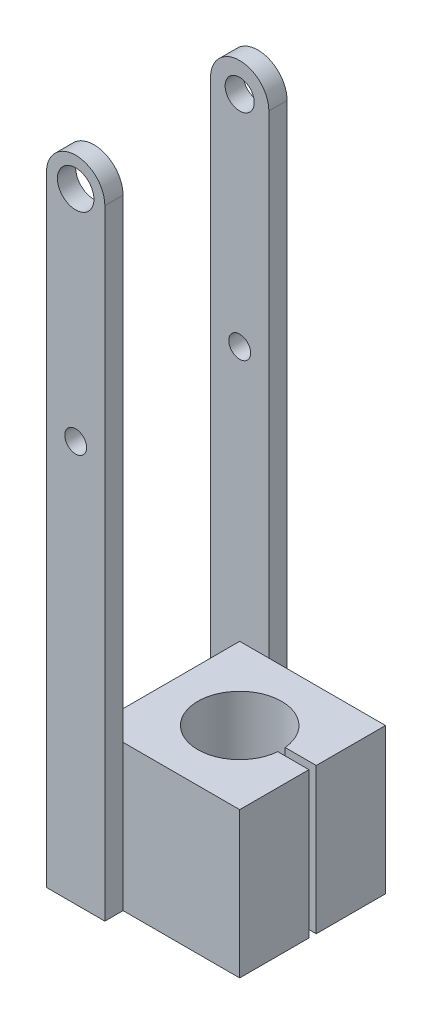
ISO-10303-21;
HEADER;
FILE_DESCRIPTION(('STEP AP214'),'2;1');
FILE_NAME('part.step','',(''),(''),'','','');
FILE_SCHEMA(('AUTOMOTIVE_DESIGN { 1 0 10303 214 1 1 1 1 }'));
ENDSEC;
DATA;
#1=APPLICATION_CONTEXT('core data for automotive mechanical design processes');
#2=APPLICATION_PROTOCOL_DEFINITION('international standard','automotive_design',2000,#1);
#3=PRODUCT_CONTEXT('',#1,'mechanical');
#4=PRODUCT('Part','Part','',(#3));
#5=PRODUCT_RELATED_PRODUCT_CATEGORY('part','',(#4));
#6=PRODUCT_DEFINITION_FORMATION('','',#4);
#7=PRODUCT_DEFINITION_CONTEXT('part definition',#1,'design');
#8=PRODUCT_DEFINITION('design','',#6,#7);
#9=PRODUCT_DEFINITION_SHAPE('','',#8);
#10=(LENGTH_UNIT() NAMED_UNIT(*) SI_UNIT(.MILLI.,.METRE.));
#11=(NAMED_UNIT(*) PLANE_ANGLE_UNIT() SI_UNIT($,.RADIAN.));
#12=(NAMED_UNIT(*) SI_UNIT($,.STERADIAN.) SOLID_ANGLE_UNIT());
#13=UNCERTAINTY_MEASURE_WITH_UNIT(LENGTH_MEASURE(1.E-05),#10,'distance_accuracy_value','');
#14=(GEOMETRIC_REPRESENTATION_CONTEXT(3) GLOBAL_UNCERTAINTY_ASSIGNED_CONTEXT((#13)) GLOBAL_UNIT_ASSIGNED_CONTEXT((#10,
#11,#12)) REPRESENTATION_CONTEXT('',''));
#15=CARTESIAN_POINT('',(0.,0.,0.));
#16=DIRECTION('',(0.,0.,1.));
#17=DIRECTION('',(1.,0.,0.));
#18=AXIS2_PLACEMENT_3D('',#15,#16,#17);
#19=CARTESIAN_POINT('',(-20.,40.,-20.));
#20=DIRECTION('',(0.,0.,1.));
#21=DIRECTION('',(1.,0.,0.));
#22=AXIS2_PLACEMENT_3D('',#19,#20,#21);
#23=PLANE('',#22);
#24=DIRECTION('',(0.,-1.,0.));
#25=VECTOR('',#24,1.);
#26=CARTESIAN_POINT('',(-12.,170.,-20.));
#27=LINE('',#26,#25);
#28=CARTESIAN_POINT('',(-12.,40.,-20.));
#29=VERTEX_POINT('',#28);
#30=CARTESIAN_POINT('',(-12.,0.,-20.));
#31=VERTEX_POINT('',#30);
#32=EDGE_CURVE('E11',#29,#31,#27,.T.);
#33=ORIENTED_EDGE('',*,*,#32,.F.);
#34=DIRECTION('',(-1.,0.,0.));
#35=VECTOR('',#34,1.);
#36=CARTESIAN_POINT('',(-20.,40.,-20.));
#37=LINE('',#36,#35);
#38=CARTESIAN_POINT('',(20.,40.,-20.));
#39=VERTEX_POINT('',#38);
#40=EDGE_CURVE('E217',#39,#29,#37,.T.);
#41=ORIENTED_EDGE('',*,*,#40,.F.);
#42=DIRECTION('',(0.,-1.,0.));
#43=VECTOR('',#42,1.);
#44=CARTESIAN_POINT('',(20.,40.,-20.));
#45=LINE('',#44,#43);
#46=CARTESIAN_POINT('',(20.,0.,-20.));
#47=VERTEX_POINT('',#46);
#48=EDGE_CURVE('E292',#39,#47,#45,.T.);
#49=ORIENTED_EDGE('',*,*,#48,.T.);
#50=DIRECTION('',(-1.,0.,0.));
#51=VECTOR('',#50,1.);
#52=CARTESIAN_POINT('',(-20.,0.,-20.));
#53=LINE('',#52,#51);
#54=EDGE_CURVE('E267',#47,#31,#53,.T.);
#55=ORIENTED_EDGE('',*,*,#54,.T.);
#56=EDGE_LOOP('',(#33,#41,#49,#55));
#57=FACE_BOUND('',#56,.T.);
#58=ADVANCED_FACE('F31',(#57),#23,.F.);
#59=CARTESIAN_POINT('',(20.,40.,20.));
#60=DIRECTION('',(0.,0.,-1.));
#61=DIRECTION('',(-1.,0.,0.));
#62=AXIS2_PLACEMENT_3D('',#59,#60,#61);
#63=PLANE('',#62);
#64=DIRECTION('',(0.,1.,0.));
#65=VECTOR('',#64,1.);
#66=CARTESIAN_POINT('',(-12.,170.,20.));
#67=LINE('',#66,#65);
#68=CARTESIAN_POINT('',(-12.,0.,20.));
#69=VERTEX_POINT('',#68);
#70=CARTESIAN_POINT('',(-12.,40.,20.));
#71=VERTEX_POINT('',#70);
#72=EDGE_CURVE('E54',#69,#71,#67,.T.);
#73=ORIENTED_EDGE('',*,*,#72,.F.);
#74=DIRECTION('',(1.,0.,0.));
#75=VECTOR('',#74,1.);
#76=CARTESIAN_POINT('',(20.,0.,20.));
#77=LINE('',#76,#75);
#78=CARTESIAN_POINT('',(20.,0.,20.));
#79=VERTEX_POINT('',#78);
#80=EDGE_CURVE('E229',#69,#79,#77,.T.);
#81=ORIENTED_EDGE('',*,*,#80,.T.);
#82=DIRECTION('',(0.,-1.,0.));
#83=VECTOR('',#82,1.);
#84=CARTESIAN_POINT('',(20.,40.,20.));
#85=LINE('',#84,#83);
#86=CARTESIAN_POINT('',(20.,40.,20.));
#87=VERTEX_POINT('',#86);
#88=EDGE_CURVE('E336',#87,#79,#85,.T.);
#89=ORIENTED_EDGE('',*,*,#88,.F.);
#90=DIRECTION('',(1.,0.,0.));
#91=VECTOR('',#90,1.);
#92=CARTESIAN_POINT('',(20.,40.,20.));
#93=LINE('',#92,#91);
#94=EDGE_CURVE('E266',#71,#87,#93,.T.);
#95=ORIENTED_EDGE('',*,*,#94,.F.);
#96=EDGE_LOOP('',(#73,#81,#89,#95));
#97=FACE_BOUND('',#96,.T.);
#98=ADVANCED_FACE('F300',(#97),#63,.F.);
#99=CARTESIAN_POINT('',(-20.,40.,-20.));
#100=DIRECTION('',(1.,0.,0.));
#101=DIRECTION('',(0.,0.,-1.));
#102=AXIS2_PLACEMENT_3D('',#99,#100,#101);
#103=PLANE('',#102);
#104=DIRECTION('',(0.,0.,1.));
#105=VECTOR('',#104,1.);
#106=CARTESIAN_POINT('',(-20.,0.,-20.));
#107=LINE('',#106,#105);
#108=CARTESIAN_POINT('',(-20.,0.,-20.));
#109=VERTEX_POINT('',#108);
#110=CARTESIAN_POINT('',(-20.,0.,20.));
#111=VERTEX_POINT('',#110);
#112=EDGE_CURVE('E232',#109,#111,#107,.T.);
#113=ORIENTED_EDGE('',*,*,#112,.T.);
#114=DIRECTION('',(0.,-1.,0.));
#115=VECTOR('',#114,1.);
#116=CARTESIAN_POINT('',(-20.,40.,20.));
#117=LINE('',#116,#115);
#118=CARTESIAN_POINT('',(-20.,40.,20.));
#119=VERTEX_POINT('',#118);
#120=EDGE_CURVE('E40',#119,#111,#117,.T.);
#121=ORIENTED_EDGE('',*,*,#120,.F.);
#122=DIRECTION('',(0.,0.,1.));
#123=VECTOR('',#122,1.);
#124=CARTESIAN_POINT('',(-20.,40.,-20.));
#125=LINE('',#124,#123);
#126=CARTESIAN_POINT('',(-20.,40.,-20.));
#127=VERTEX_POINT('',#126);
#128=EDGE_CURVE('E264',#127,#119,#125,.T.);
#129=ORIENTED_EDGE('',*,*,#128,.F.);
#130=DIRECTION('',(0.,-1.,0.));
#131=VECTOR('',#130,1.);
#132=CARTESIAN_POINT('',(-20.,40.,-20.));
#133=LINE('',#132,#131);
#134=EDGE_CURVE('E214',#127,#109,#133,.T.);
#135=ORIENTED_EDGE('',*,*,#134,.T.);
#136=EDGE_LOOP('',(#113,#121,#129,#135));
#137=FACE_BOUND('',#136,.T.);
#138=ADVANCED_FACE('F33',(#137),#103,.F.);
#139=CARTESIAN_POINT('',(20.,40.,1.));
#140=DIRECTION('',(-1.,0.,0.));
#141=DIRECTION('',(0.,0.,1.));
#142=AXIS2_PLACEMENT_3D('',#139,#140,#141);
#143=PLANE('',#142);
#144=DIRECTION('',(0.,0.,-1.));
#145=VECTOR('',#144,1.);
#146=CARTESIAN_POINT('',(20.,0.,1.));
#147=LINE('',#146,#145);
#148=CARTESIAN_POINT('',(20.,0.,1.));
#149=VERTEX_POINT('',#148);
#150=EDGE_CURVE('E226',#79,#149,#147,.T.);
#151=ORIENTED_EDGE('',*,*,#150,.T.);
#152=DIRECTION('',(0.,-1.,0.));
#153=VECTOR('',#152,1.);
#154=CARTESIAN_POINT('',(20.,40.,1.));
#155=LINE('',#154,#153);
#156=CARTESIAN_POINT('',(20.,40.,1.));
#157=VERTEX_POINT('',#156);
#158=EDGE_CURVE('E333',#157,#149,#155,.T.);
#159=ORIENTED_EDGE('',*,*,#158,.F.);
#160=DIRECTION('',(0.,0.,-1.));
#161=VECTOR('',#160,1.);
#162=CARTESIAN_POINT('',(20.,40.,1.));
#163=LINE('',#162,#161);
#164=EDGE_CURVE('E270',#87,#157,#163,.T.);
#165=ORIENTED_EDGE('',*,*,#164,.F.);
#166=ORIENTED_EDGE('',*,*,#88,.T.);
#167=EDGE_LOOP('',(#151,#159,#165,#166));
#168=FACE_BOUND('',#167,.T.);
#169=ADVANCED_FACE('F320',(#168),#143,.F.);
#170=CARTESIAN_POINT('',(11.4564392373896,40.,1.));
#171=DIRECTION('',(0.,0.,1.));
#172=DIRECTION('',(1.,0.,0.));
#173=AXIS2_PLACEMENT_3D('',#170,#171,#172);
#174=PLANE('',#173);
#175=DIRECTION('',(-1.,0.,0.));
#176=VECTOR('',#175,1.);
#177=CARTESIAN_POINT('',(11.4564392373896,0.,1.));
#178=LINE('',#177,#176);
#179=CARTESIAN_POINT('',(11.4564392373896,0.,1.));
#180=VERTEX_POINT('',#179);
#181=EDGE_CURVE('E339',#149,#180,#178,.T.);
#182=ORIENTED_EDGE('',*,*,#181,.T.);
#183=DIRECTION('',(0.,-1.,0.));
#184=VECTOR('',#183,1.);
#185=CARTESIAN_POINT('',(11.4564392373896,40.,1.));
#186=LINE('',#185,#184);
#187=CARTESIAN_POINT('',(11.4564392373896,40.,1.));
#188=VERTEX_POINT('',#187);
#189=EDGE_CURVE('E342',#188,#180,#186,.T.);
#190=ORIENTED_EDGE('',*,*,#189,.F.);
#191=DIRECTION('',(-1.,0.,0.));
#192=VECTOR('',#191,1.);
#193=CARTESIAN_POINT('',(11.4564392373896,40.,1.));
#194=LINE('',#193,#192);
#195=EDGE_CURVE('E272',#157,#188,#194,.T.);
#196=ORIENTED_EDGE('',*,*,#195,.F.);
#197=ORIENTED_EDGE('',*,*,#158,.T.);
#198=EDGE_LOOP('',(#182,#190,#196,#197));
#199=FACE_BOUND('',#198,.T.);
#200=ADVANCED_FACE('F316',(#199),#174,.F.);
#201=CARTESIAN_POINT('',(0.,40.,0.));
#202=DIRECTION('',(0.,-1.,0.));
#203=DIRECTION('',(0.,0.,-1.));
#204=AXIS2_PLACEMENT_3D('',#201,#202,#203);
#205=CYLINDRICAL_SURFACE('',#204,11.5);
#206=CARTESIAN_POINT('',(0.,0.,0.));
#207=DIRECTION('',(0.,-1.,0.));
#208=DIRECTION('',(0.,0.,1.));
#209=AXIS2_PLACEMENT_3D('',#206,#207,#208);
#210=CIRCLE('',#209,11.5);
#211=CARTESIAN_POINT('',(11.4564392373896,0.,-1.));
#212=VERTEX_POINT('',#211);
#213=EDGE_CURVE('E346',#180,#212,#210,.T.);
#214=ORIENTED_EDGE('',*,*,#213,.T.);
#215=DIRECTION('',(0.,-1.,0.));
#216=VECTOR('',#215,1.);
#217=CARTESIAN_POINT('',(11.4564392373896,40.,-1.));
#218=LINE('',#217,#216);
#219=CARTESIAN_POINT('',(11.4564392373896,40.,-1.));
#220=VERTEX_POINT('',#219);
#221=EDGE_CURVE('E291',#220,#212,#218,.T.);
#222=ORIENTED_EDGE('',*,*,#221,.F.);
#223=CARTESIAN_POINT('',(0.,40.,0.));
#224=DIRECTION('',(0.,-1.,0.));
#225=DIRECTION('',(0.,0.,1.));
#226=AXIS2_PLACEMENT_3D('',#223,#224,#225);
#227=CIRCLE('',#226,11.5);
#228=EDGE_CURVE('E274',#188,#220,#227,.T.);
#229=ORIENTED_EDGE('',*,*,#228,.F.);
#230=ORIENTED_EDGE('',*,*,#189,.T.);
#231=EDGE_LOOP('',(#214,#222,#229,#230));
#232=FACE_BOUND('',#231,.T.);
#233=ADVANCED_FACE('F313',(#232),#205,.F.);
#234=CARTESIAN_POINT('',(11.4564392373896,40.,-1.));
#235=DIRECTION('',(0.,0.,-1.));
#236=DIRECTION('',(-1.,0.,0.));
#237=AXIS2_PLACEMENT_3D('',#234,#235,#236);
#238=PLANE('',#237);
#239=DIRECTION('',(1.,0.,0.));
#240=VECTOR('',#239,1.);
#241=CARTESIAN_POINT('',(11.4564392373896,0.,-1.));
#242=LINE('',#241,#240);
#243=CARTESIAN_POINT('',(20.,0.,-1.));
#244=VERTEX_POINT('',#243);
#245=EDGE_CURVE('E288',#212,#244,#242,.T.);
#246=ORIENTED_EDGE('',*,*,#245,.T.);
#247=DIRECTION('',(0.,-1.,0.));
#248=VECTOR('',#247,1.);
#249=CARTESIAN_POINT('',(20.,40.,-1.));
#250=LINE('',#249,#248);
#251=CARTESIAN_POINT('',(20.,40.,-1.));
#252=VERTEX_POINT('',#251);
#253=EDGE_CURVE('E285',#252,#244,#250,.T.);
#254=ORIENTED_EDGE('',*,*,#253,.F.);
#255=DIRECTION('',(1.,0.,0.));
#256=VECTOR('',#255,1.);
#257=CARTESIAN_POINT('',(11.4564392373896,40.,-1.));
#258=LINE('',#257,#256);
#259=EDGE_CURVE('E220',#220,#252,#258,.T.);
#260=ORIENTED_EDGE('',*,*,#259,.F.);
#261=ORIENTED_EDGE('',*,*,#221,.T.);
#262=EDGE_LOOP('',(#246,#254,#260,#261));
#263=FACE_BOUND('',#262,.T.);
#264=ADVANCED_FACE('F286',(#263),#238,.F.);
#265=CARTESIAN_POINT('',(20.,40.,-20.));
#266=DIRECTION('',(-1.,0.,0.));
#267=DIRECTION('',(0.,0.,1.));
#268=AXIS2_PLACEMENT_3D('',#265,#266,#267);
#269=PLANE('',#268);
#270=DIRECTION('',(0.,0.,-1.));
#271=VECTOR('',#270,1.);
#272=CARTESIAN_POINT('',(20.,0.,-20.));
#273=LINE('',#272,#271);
#274=EDGE_CURVE('E296',#244,#47,#273,.T.);
#275=ORIENTED_EDGE('',*,*,#274,.T.);
#276=ORIENTED_EDGE('',*,*,#48,.F.);
#277=DIRECTION('',(0.,0.,-1.));
#278=VECTOR('',#277,1.);
#279=CARTESIAN_POINT('',(20.,40.,-20.));
#280=LINE('',#279,#278);
#281=EDGE_CURVE('E218',#252,#39,#280,.T.);
#282=ORIENTED_EDGE('',*,*,#281,.F.);
#283=ORIENTED_EDGE('',*,*,#253,.T.);
#284=EDGE_LOOP('',(#275,#276,#282,#283));
#285=FACE_BOUND('',#284,.T.);
#286=ADVANCED_FACE('F294',(#285),#269,.F.);
#287=CARTESIAN_POINT('',(0.,40.,0.));
#288=DIRECTION('',(0.,1.,0.));
#289=DIRECTION('',(0.,0.,1.));
#290=AXIS2_PLACEMENT_3D('',#287,#288,#289);
#291=PLANE('',#290);
#292=ORIENTED_EDGE('',*,*,#128,.T.);
#293=EDGE_CURVE('E268',#119,#71,#93,.T.);
#294=ORIENTED_EDGE('',*,*,#293,.T.);
#295=ORIENTED_EDGE('',*,*,#94,.T.);
#296=ORIENTED_EDGE('',*,*,#164,.T.);
#297=ORIENTED_EDGE('',*,*,#195,.T.);
#298=ORIENTED_EDGE('',*,*,#228,.T.);
#299=ORIENTED_EDGE('',*,*,#259,.T.);
#300=ORIENTED_EDGE('',*,*,#281,.T.);
#301=ORIENTED_EDGE('',*,*,#40,.T.);
#302=EDGE_CURVE('E212',#29,#127,#37,.T.);
#303=ORIENTED_EDGE('',*,*,#302,.T.);
#304=EDGE_LOOP('',(#292,#294,#295,#296,#297,#298,#299,#300,#301,#303));
#305=FACE_BOUND('',#304,.T.);
#306=ADVANCED_FACE('F277',(#305),#291,.T.);
#307=CARTESIAN_POINT('',(0.,0.,0.));
#308=DIRECTION('',(0.,1.,0.));
#309=DIRECTION('',(0.,0.,1.));
#310=AXIS2_PLACEMENT_3D('',#307,#308,#309);
#311=PLANE('',#310);
#312=ORIENTED_EDGE('',*,*,#112,.F.);
#313=DIRECTION('',(-1.,0.,0.));
#314=VECTOR('',#313,1.);
#315=CARTESIAN_POINT('',(-12.,0.,-20.));
#316=LINE('',#315,#314);
#317=CARTESIAN_POINT('',(-28.,0.,-20.));
#318=VERTEX_POINT('',#317);
#319=EDGE_CURVE('E173',#109,#318,#316,.T.);
#320=ORIENTED_EDGE('',*,*,#319,.T.);
#321=DIRECTION('',(0.,0.,1.));
#322=VECTOR('',#321,1.);
#323=CARTESIAN_POINT('',(-28.,0.,-25.));
#324=LINE('',#323,#322);
#325=CARTESIAN_POINT('',(-28.,0.,-25.));
#326=VERTEX_POINT('',#325);
#327=EDGE_CURVE('E194',#326,#318,#324,.T.);
#328=ORIENTED_EDGE('',*,*,#327,.F.);
#329=DIRECTION('',(-1.,0.,0.));
#330=VECTOR('',#329,1.);
#331=CARTESIAN_POINT('',(-12.,0.,-25.));
#332=LINE('',#331,#330);
#333=CARTESIAN_POINT('',(-12.,0.,-25.));
#334=VERTEX_POINT('',#333);
#335=EDGE_CURVE('E169',#334,#326,#332,.T.);
#336=ORIENTED_EDGE('',*,*,#335,.F.);
#337=DIRECTION('',(0.,0.,1.));
#338=VECTOR('',#337,1.);
#339=CARTESIAN_POINT('',(-12.,0.,-25.));
#340=LINE('',#339,#338);
#341=EDGE_CURVE('E183',#334,#31,#340,.T.);
#342=ORIENTED_EDGE('',*,*,#341,.T.);
#343=ORIENTED_EDGE('',*,*,#54,.F.);
#344=ORIENTED_EDGE('',*,*,#274,.F.);
#345=ORIENTED_EDGE('',*,*,#245,.F.);
#346=ORIENTED_EDGE('',*,*,#213,.F.);
#347=ORIENTED_EDGE('',*,*,#181,.F.);
#348=ORIENTED_EDGE('',*,*,#150,.F.);
#349=ORIENTED_EDGE('',*,*,#80,.F.);
#350=DIRECTION('',(0.,0.,-1.));
#351=VECTOR('',#350,1.);
#352=CARTESIAN_POINT('',(-12.,0.,25.));
#353=LINE('',#352,#351);
#354=CARTESIAN_POINT('',(-12.,0.,25.));
#355=VERTEX_POINT('',#354);
#356=EDGE_CURVE('E239',#355,#69,#353,.T.);
#357=ORIENTED_EDGE('',*,*,#356,.F.);
#358=DIRECTION('',(1.,0.,0.));
#359=VECTOR('',#358,1.);
#360=CARTESIAN_POINT('',(-28.,0.,25.));
#361=LINE('',#360,#359);
#362=CARTESIAN_POINT('',(-28.,0.,25.));
#363=VERTEX_POINT('',#362);
#364=EDGE_CURVE('E250',#363,#355,#361,.T.);
#365=ORIENTED_EDGE('',*,*,#364,.F.);
#366=DIRECTION('',(0.,0.,-1.));
#367=VECTOR('',#366,1.);
#368=CARTESIAN_POINT('',(-28.,0.,25.));
#369=LINE('',#368,#367);
#370=CARTESIAN_POINT('',(-28.,0.,20.));
#371=VERTEX_POINT('',#370);
#372=EDGE_CURVE('E251',#363,#371,#369,.T.);
#373=ORIENTED_EDGE('',*,*,#372,.T.);
#374=DIRECTION('',(1.,0.,0.));
#375=VECTOR('',#374,1.);
#376=CARTESIAN_POINT('',(-28.,0.,20.));
#377=LINE('',#376,#375);
#378=EDGE_CURVE('E244',#371,#111,#377,.T.);
#379=ORIENTED_EDGE('',*,*,#378,.T.);
#380=EDGE_LOOP('',(#312,#320,#328,#336,#342,#343,#344,#345,#346,#347,#348,#349,#357,#365,#373,#379));
#381=FACE_BOUND('',#380,.T.);
#382=ADVANCED_FACE('F307',(#381),#311,.F.);
#383=CARTESIAN_POINT('',(-20.,170.,25.));
#384=DIRECTION('',(0.,0.,1.));
#385=DIRECTION('',(1.,0.,0.));
#386=AXIS2_PLACEMENT_3D('',#383,#384,#385);
#387=PLANE('',#386);
#388=CARTESIAN_POINT('',(-20.,110.,25.));
#389=DIRECTION('',(0.,0.,1.));
#390=DIRECTION('',(1.,0.,0.));
#391=AXIS2_PLACEMENT_3D('',#388,#389,#390);
#392=CIRCLE('',#391,3.);
#393=CARTESIAN_POINT('',(-17.,110.,25.));
#394=VERTEX_POINT('',#393);
#395=EDGE_CURVE('E263',#394,#394,#392,.T.);
#396=ORIENTED_EDGE('',*,*,#395,.F.);
#397=EDGE_LOOP('',(#396));
#398=FACE_BOUND('',#397,.T.);
#399=ORIENTED_EDGE('',*,*,#364,.T.);
#400=DIRECTION('',(0.,1.,0.));
#401=VECTOR('',#400,1.);
#402=CARTESIAN_POINT('',(-12.,170.,25.));
#403=LINE('',#402,#401);
#404=CARTESIAN_POINT('',(-12.,170.,25.));
#405=VERTEX_POINT('',#404);
#406=EDGE_CURVE('E378',#355,#405,#403,.T.);
#407=ORIENTED_EDGE('',*,*,#406,.T.);
#408=CARTESIAN_POINT('',(-20.,170.,25.));
#409=DIRECTION('',(0.,0.,1.));
#410=DIRECTION('',(1.,0.,0.));
#411=AXIS2_PLACEMENT_3D('',#408,#409,#410);
#412=CIRCLE('',#411,8.);
#413=CARTESIAN_POINT('',(-28.,170.,25.));
#414=VERTEX_POINT('',#413);
#415=EDGE_CURVE('E382',#405,#414,#412,.T.);
#416=ORIENTED_EDGE('',*,*,#415,.T.);
#417=DIRECTION('',(0.,-1.,0.));
#418=VECTOR('',#417,1.);
#419=CARTESIAN_POINT('',(-28.,170.,25.));
#420=LINE('',#419,#418);
#421=EDGE_CURVE('E255',#414,#363,#420,.T.);
#422=ORIENTED_EDGE('',*,*,#421,.T.);
#423=EDGE_LOOP('',(#399,#407,#416,#422));
#424=FACE_BOUND('',#423,.T.);
#425=CARTESIAN_POINT('',(-20.,170.,25.));
#426=DIRECTION('',(0.,0.,1.));
#427=DIRECTION('',(1.,0.,0.));
#428=AXIS2_PLACEMENT_3D('',#425,#426,#427);
#429=CIRCLE('',#428,5.);
#430=CARTESIAN_POINT('',(-15.,170.,25.));
#431=VERTEX_POINT('',#430);
#432=EDGE_CURVE('E181',#431,#431,#429,.T.);
#433=ORIENTED_EDGE('',*,*,#432,.F.);
#434=EDGE_LOOP('',(#433));
#435=FACE_BOUND('',#434,.T.);
#436=ADVANCED_FACE('F384',(#398,#424,#435),#387,.T.);
#437=CARTESIAN_POINT('',(-20.,170.,20.));
#438=DIRECTION('',(0.,0.,1.));
#439=DIRECTION('',(1.,0.,0.));
#440=AXIS2_PLACEMENT_3D('',#437,#438,#439);
#441=PLANE('',#440);
#442=ORIENTED_EDGE('',*,*,#293,.F.);
#443=ORIENTED_EDGE('',*,*,#120,.T.);
#444=ORIENTED_EDGE('',*,*,#378,.F.);
#445=DIRECTION('',(0.,-1.,0.));
#446=VECTOR('',#445,1.);
#447=CARTESIAN_POINT('',(-28.,170.,20.));
#448=LINE('',#447,#446);
#449=CARTESIAN_POINT('',(-28.,170.,20.));
#450=VERTEX_POINT('',#449);
#451=EDGE_CURVE('E248',#450,#371,#448,.T.);
#452=ORIENTED_EDGE('',*,*,#451,.F.);
#453=CARTESIAN_POINT('',(-20.,170.,20.));
#454=DIRECTION('',(0.,0.,1.));
#455=DIRECTION('',(1.,0.,0.));
#456=AXIS2_PLACEMENT_3D('',#453,#454,#455);
#457=CIRCLE('',#456,8.);
#458=CARTESIAN_POINT('',(-12.,170.,20.));
#459=VERTEX_POINT('',#458);
#460=EDGE_CURVE('E237',#459,#450,#457,.T.);
#461=ORIENTED_EDGE('',*,*,#460,.F.);
#462=EDGE_CURVE('E238',#71,#459,#67,.T.);
#463=ORIENTED_EDGE('',*,*,#462,.F.);
#464=EDGE_LOOP('',(#442,#443,#444,#452,#461,#463));
#465=FACE_BOUND('',#464,.T.);
#466=CARTESIAN_POINT('',(-20.,110.,20.));
#467=DIRECTION('',(0.,0.,1.));
#468=DIRECTION('',(1.,0.,0.));
#469=AXIS2_PLACEMENT_3D('',#466,#467,#468);
#470=CIRCLE('',#469,3.);
#471=CARTESIAN_POINT('',(-17.,110.,20.));
#472=VERTEX_POINT('',#471);
#473=EDGE_CURVE('E390',#472,#472,#470,.T.);
#474=ORIENTED_EDGE('',*,*,#473,.T.);
#475=EDGE_LOOP('',(#474));
#476=FACE_BOUND('',#475,.T.);
#477=CARTESIAN_POINT('',(-20.,170.,20.));
#478=DIRECTION('',(0.,0.,1.));
#479=DIRECTION('',(1.,0.,0.));
#480=AXIS2_PLACEMENT_3D('',#477,#478,#479);
#481=CIRCLE('',#480,5.);
#482=CARTESIAN_POINT('',(-15.,170.,20.));
#483=VERTEX_POINT('',#482);
#484=EDGE_CURVE('E178',#483,#483,#481,.T.);
#485=ORIENTED_EDGE('',*,*,#484,.T.);
#486=EDGE_LOOP('',(#485));
#487=FACE_BOUND('',#486,.T.);
#488=ADVANCED_FACE('F368',(#465,#476,#487),#441,.F.);
#489=CARTESIAN_POINT('',(-12.,170.,25.));
#490=DIRECTION('',(-1.,0.,0.));
#491=DIRECTION('',(0.,0.,1.));
#492=AXIS2_PLACEMENT_3D('',#489,#490,#491);
#493=PLANE('',#492);
#494=ORIENTED_EDGE('',*,*,#72,.T.);
#495=ORIENTED_EDGE('',*,*,#462,.T.);
#496=DIRECTION('',(0.,0.,-1.));
#497=VECTOR('',#496,1.);
#498=CARTESIAN_POINT('',(-12.,170.,25.));
#499=LINE('',#498,#497);
#500=EDGE_CURVE('E258',#405,#459,#499,.T.);
#501=ORIENTED_EDGE('',*,*,#500,.F.);
#502=ORIENTED_EDGE('',*,*,#406,.F.);
#503=ORIENTED_EDGE('',*,*,#356,.T.);
#504=EDGE_LOOP('',(#494,#495,#501,#502,#503));
#505=FACE_BOUND('',#504,.T.);
#506=ADVANCED_FACE('F376',(#505),#493,.F.);
#507=CARTESIAN_POINT('',(-20.,170.,25.));
#508=DIRECTION('',(0.,0.,-1.));
#509=DIRECTION('',(-1.,0.,0.));
#510=AXIS2_PLACEMENT_3D('',#507,#508,#509);
#511=CYLINDRICAL_SURFACE('',#510,8.);
#512=ORIENTED_EDGE('',*,*,#460,.T.);
#513=DIRECTION('',(0.,0.,-1.));
#514=VECTOR('',#513,1.);
#515=CARTESIAN_POINT('',(-28.,170.,25.));
#516=LINE('',#515,#514);
#517=EDGE_CURVE('E254',#414,#450,#516,.T.);
#518=ORIENTED_EDGE('',*,*,#517,.F.);
#519=ORIENTED_EDGE('',*,*,#415,.F.);
#520=ORIENTED_EDGE('',*,*,#500,.T.);
#521=EDGE_LOOP('',(#512,#518,#519,#520));
#522=FACE_BOUND('',#521,.T.);
#523=ADVANCED_FACE('F395',(#522),#511,.T.);
#524=CARTESIAN_POINT('',(-28.,170.,25.));
#525=DIRECTION('',(1.,0.,0.));
#526=DIRECTION('',(0.,0.,-1.));
#527=AXIS2_PLACEMENT_3D('',#524,#525,#526);
#528=PLANE('',#527);
#529=ORIENTED_EDGE('',*,*,#451,.T.);
#530=ORIENTED_EDGE('',*,*,#372,.F.);
#531=ORIENTED_EDGE('',*,*,#421,.F.);
#532=ORIENTED_EDGE('',*,*,#517,.T.);
#533=EDGE_LOOP('',(#529,#530,#531,#532));
#534=FACE_BOUND('',#533,.T.);
#535=ADVANCED_FACE('F397',(#534),#528,.F.);
#536=CARTESIAN_POINT('',(-20.,110.,25.));
#537=DIRECTION('',(0.,0.,-1.));
#538=DIRECTION('',(-1.,0.,0.));
#539=AXIS2_PLACEMENT_3D('',#536,#537,#538);
#540=CYLINDRICAL_SURFACE('',#539,3.);
#541=ORIENTED_EDGE('',*,*,#395,.T.);
#542=EDGE_LOOP('',(#541));
#543=FACE_BOUND('',#542,.T.);
#544=ORIENTED_EDGE('',*,*,#473,.F.);
#545=EDGE_LOOP('',(#544));
#546=FACE_BOUND('',#545,.T.);
#547=ADVANCED_FACE('F399',(#543,#546),#540,.F.);
#548=CARTESIAN_POINT('',(-20.,170.,25.));
#549=DIRECTION('',(0.,0.,-1.));
#550=DIRECTION('',(-1.,0.,0.));
#551=AXIS2_PLACEMENT_3D('',#548,#549,#550);
#552=CYLINDRICAL_SURFACE('',#551,5.);
#553=ORIENTED_EDGE('',*,*,#432,.T.);
#554=EDGE_LOOP('',(#553));
#555=FACE_BOUND('',#554,.T.);
#556=ORIENTED_EDGE('',*,*,#484,.F.);
#557=EDGE_LOOP('',(#556));
#558=FACE_BOUND('',#557,.T.);
#559=ADVANCED_FACE('F405',(#555,#558),#552,.F.);
#560=CARTESIAN_POINT('',(-20.,170.,-25.));
#561=DIRECTION('',(0.,0.,-1.));
#562=DIRECTION('',(-1.,0.,0.));
#563=AXIS2_PLACEMENT_3D('',#560,#561,#562);
#564=PLANE('',#563);
#565=CARTESIAN_POINT('',(-20.,110.,-25.));
#566=DIRECTION('',(0.,0.,-1.));
#567=DIRECTION('',(-1.,0.,0.));
#568=AXIS2_PLACEMENT_3D('',#565,#566,#567);
#569=CIRCLE('',#568,3.);
#570=CARTESIAN_POINT('',(-23.,110.,-25.));
#571=VERTEX_POINT('',#570);
#572=EDGE_CURVE('E201',#571,#571,#569,.T.);
#573=ORIENTED_EDGE('',*,*,#572,.F.);
#574=EDGE_LOOP('',(#573));
#575=FACE_BOUND('',#574,.T.);
#576=DIRECTION('',(0.,1.,0.));
#577=VECTOR('',#576,1.);
#578=CARTESIAN_POINT('',(-28.,0.,-25.));
#579=LINE('',#578,#577);
#580=CARTESIAN_POINT('',(-28.,170.,-25.));
#581=VERTEX_POINT('',#580);
#582=EDGE_CURVE('E163',#326,#581,#579,.T.);
#583=ORIENTED_EDGE('',*,*,#582,.T.);
#584=CARTESIAN_POINT('',(-20.,170.,-25.));
#585=DIRECTION('',(0.,0.,-1.));
#586=DIRECTION('',(-1.,0.,0.));
#587=AXIS2_PLACEMENT_3D('',#584,#585,#586);
#588=CIRCLE('',#587,8.);
#589=CARTESIAN_POINT('',(-12.,170.,-25.));
#590=VERTEX_POINT('',#589);
#591=EDGE_CURVE('E152',#581,#590,#588,.T.);
#592=ORIENTED_EDGE('',*,*,#591,.T.);
#593=DIRECTION('',(0.,-1.,0.));
#594=VECTOR('',#593,1.);
#595=CARTESIAN_POINT('',(-12.,170.,-25.));
#596=LINE('',#595,#594);
#597=EDGE_CURVE('E162',#590,#334,#596,.T.);
#598=ORIENTED_EDGE('',*,*,#597,.T.);
#599=ORIENTED_EDGE('',*,*,#335,.T.);
#600=EDGE_LOOP('',(#583,#592,#598,#599));
#601=FACE_BOUND('',#600,.T.);
#602=CARTESIAN_POINT('',(-20.,170.,-25.));
#603=DIRECTION('',(0.,0.,-1.));
#604=DIRECTION('',(-1.,0.,0.));
#605=AXIS2_PLACEMENT_3D('',#602,#603,#604);
#606=CIRCLE('',#605,4.);
#607=CARTESIAN_POINT('',(-24.,170.,-25.));
#608=VERTEX_POINT('',#607);
#609=EDGE_CURVE('E452',#608,#608,#606,.T.);
#610=ORIENTED_EDGE('',*,*,#609,.F.);
#611=EDGE_LOOP('',(#610));
#612=FACE_BOUND('',#611,.T.);
#613=ADVANCED_FACE('F166',(#575,#601,#612),#564,.T.);
#614=CARTESIAN_POINT('',(-20.,170.,-20.));
#615=DIRECTION('',(0.,0.,-1.));
#616=DIRECTION('',(-1.,0.,0.));
#617=AXIS2_PLACEMENT_3D('',#614,#615,#616);
#618=PLANE('',#617);
#619=ORIENTED_EDGE('',*,*,#134,.F.);
#620=ORIENTED_EDGE('',*,*,#302,.F.);
#621=CARTESIAN_POINT('',(-12.,170.,-20.));
#622=VERTEX_POINT('',#621);
#623=EDGE_CURVE('E189',#622,#29,#27,.T.);
#624=ORIENTED_EDGE('',*,*,#623,.F.);
#625=CARTESIAN_POINT('',(-20.,170.,-20.));
#626=DIRECTION('',(0.,0.,-1.));
#627=DIRECTION('',(-1.,0.,0.));
#628=AXIS2_PLACEMENT_3D('',#625,#626,#627);
#629=CIRCLE('',#628,8.);
#630=CARTESIAN_POINT('',(-28.,170.,-20.));
#631=VERTEX_POINT('',#630);
#632=EDGE_CURVE('E200',#631,#622,#629,.T.);
#633=ORIENTED_EDGE('',*,*,#632,.F.);
#634=DIRECTION('',(0.,1.,0.));
#635=VECTOR('',#634,1.);
#636=CARTESIAN_POINT('',(-28.,0.,-20.));
#637=LINE('',#636,#635);
#638=EDGE_CURVE('E177',#318,#631,#637,.T.);
#639=ORIENTED_EDGE('',*,*,#638,.F.);
#640=ORIENTED_EDGE('',*,*,#319,.F.);
#641=EDGE_LOOP('',(#619,#620,#624,#633,#639,#640));
#642=FACE_BOUND('',#641,.T.);
#643=CARTESIAN_POINT('',(-20.,110.,-20.));
#644=DIRECTION('',(0.,0.,-1.));
#645=DIRECTION('',(-1.,0.,0.));
#646=AXIS2_PLACEMENT_3D('',#643,#644,#645);
#647=CIRCLE('',#646,3.);
#648=CARTESIAN_POINT('',(-23.,110.,-20.));
#649=VERTEX_POINT('',#648);
#650=EDGE_CURVE('E458',#649,#649,#647,.T.);
#651=ORIENTED_EDGE('',*,*,#650,.T.);
#652=EDGE_LOOP('',(#651));
#653=FACE_BOUND('',#652,.T.);
#654=CARTESIAN_POINT('',(-20.,170.,-20.));
#655=DIRECTION('',(0.,0.,-1.));
#656=DIRECTION('',(-1.,0.,0.));
#657=AXIS2_PLACEMENT_3D('',#654,#655,#656);
#658=CIRCLE('',#657,4.);
#659=CARTESIAN_POINT('',(-24.,170.,-20.));
#660=VERTEX_POINT('',#659);
#661=EDGE_CURVE('E455',#660,#660,#658,.T.);
#662=ORIENTED_EDGE('',*,*,#661,.T.);
#663=EDGE_LOOP('',(#662));
#664=FACE_BOUND('',#663,.T.);
#665=ADVANCED_FACE('F210',(#642,#653,#664),#618,.F.);
#666=CARTESIAN_POINT('',(-28.,0.,-25.));
#667=DIRECTION('',(1.,0.,0.));
#668=DIRECTION('',(0.,0.,-1.));
#669=AXIS2_PLACEMENT_3D('',#666,#667,#668);
#670=PLANE('',#669);
#671=ORIENTED_EDGE('',*,*,#638,.T.);
#672=DIRECTION('',(0.,0.,1.));
#673=VECTOR('',#672,1.);
#674=CARTESIAN_POINT('',(-28.,170.,-25.));
#675=LINE('',#674,#673);
#676=EDGE_CURVE('E156',#581,#631,#675,.T.);
#677=ORIENTED_EDGE('',*,*,#676,.F.);
#678=ORIENTED_EDGE('',*,*,#582,.F.);
#679=ORIENTED_EDGE('',*,*,#327,.T.);
#680=EDGE_LOOP('',(#671,#677,#678,#679));
#681=FACE_BOUND('',#680,.T.);
#682=ADVANCED_FACE('F175',(#681),#670,.F.);
#683=CARTESIAN_POINT('',(-20.,170.,-25.));
#684=DIRECTION('',(0.,0.,1.));
#685=DIRECTION('',(1.,0.,0.));
#686=AXIS2_PLACEMENT_3D('',#683,#684,#685);
#687=CYLINDRICAL_SURFACE('',#686,8.);
#688=ORIENTED_EDGE('',*,*,#632,.T.);
#689=DIRECTION('',(0.,0.,1.));
#690=VECTOR('',#689,1.);
#691=CARTESIAN_POINT('',(-12.,170.,-25.));
#692=LINE('',#691,#690);
#693=EDGE_CURVE('E159',#590,#622,#692,.T.);
#694=ORIENTED_EDGE('',*,*,#693,.F.);
#695=ORIENTED_EDGE('',*,*,#591,.F.);
#696=ORIENTED_EDGE('',*,*,#676,.T.);
#697=EDGE_LOOP('',(#688,#694,#695,#696));
#698=FACE_BOUND('',#697,.T.);
#699=ADVANCED_FACE('F154',(#698),#687,.T.);
#700=CARTESIAN_POINT('',(-12.,170.,-25.));
#701=DIRECTION('',(-1.,0.,0.));
#702=DIRECTION('',(0.,0.,1.));
#703=AXIS2_PLACEMENT_3D('',#700,#701,#702);
#704=PLANE('',#703);
#705=ORIENTED_EDGE('',*,*,#623,.T.);
#706=ORIENTED_EDGE('',*,*,#32,.T.);
#707=ORIENTED_EDGE('',*,*,#341,.F.);
#708=ORIENTED_EDGE('',*,*,#597,.F.);
#709=ORIENTED_EDGE('',*,*,#693,.T.);
#710=EDGE_LOOP('',(#705,#706,#707,#708,#709));
#711=FACE_BOUND('',#710,.T.);
#712=ADVANCED_FACE('F205',(#711),#704,.F.);
#713=CARTESIAN_POINT('',(-20.,110.,-25.));
#714=DIRECTION('',(0.,0.,1.));
#715=DIRECTION('',(1.,0.,0.));
#716=AXIS2_PLACEMENT_3D('',#713,#714,#715);
#717=CYLINDRICAL_SURFACE('',#716,3.);
#718=ORIENTED_EDGE('',*,*,#572,.T.);
#719=EDGE_LOOP('',(#718));
#720=FACE_BOUND('',#719,.T.);
#721=ORIENTED_EDGE('',*,*,#650,.F.);
#722=EDGE_LOOP('',(#721));
#723=FACE_BOUND('',#722,.T.);
#724=ADVANCED_FACE('F435',(#720,#723),#717,.F.);
#725=CARTESIAN_POINT('',(-20.,170.,-25.));
#726=DIRECTION('',(0.,0.,1.));
#727=DIRECTION('',(1.,0.,0.));
#728=AXIS2_PLACEMENT_3D('',#725,#726,#727);
#729=CYLINDRICAL_SURFACE('',#728,4.);
#730=ORIENTED_EDGE('',*,*,#609,.T.);
#731=EDGE_LOOP('',(#730));
#732=FACE_BOUND('',#731,.T.);
#733=ORIENTED_EDGE('',*,*,#661,.F.);
#734=EDGE_LOOP('',(#733));
#735=FACE_BOUND('',#734,.T.);
#736=ADVANCED_FACE('F443',(#732,#735),#729,.F.);
#737=CLOSED_SHELL('',(#58,#98,#138,#169,#200,#233,#264,#286,#306,#382,#436,#488,#506,#523,#535,
#547,#559,#613,#665,#682,#699,#712,#724,#736));
#738=MANIFOLD_SOLID_BREP('B2',#737);
#739=ADVANCED_BREP_SHAPE_REPRESENTATION('',(#18,#738),#14);
#740=SHAPE_DEFINITION_REPRESENTATION(#9,#739);
ENDSEC;
END-ISO-10303-21;
